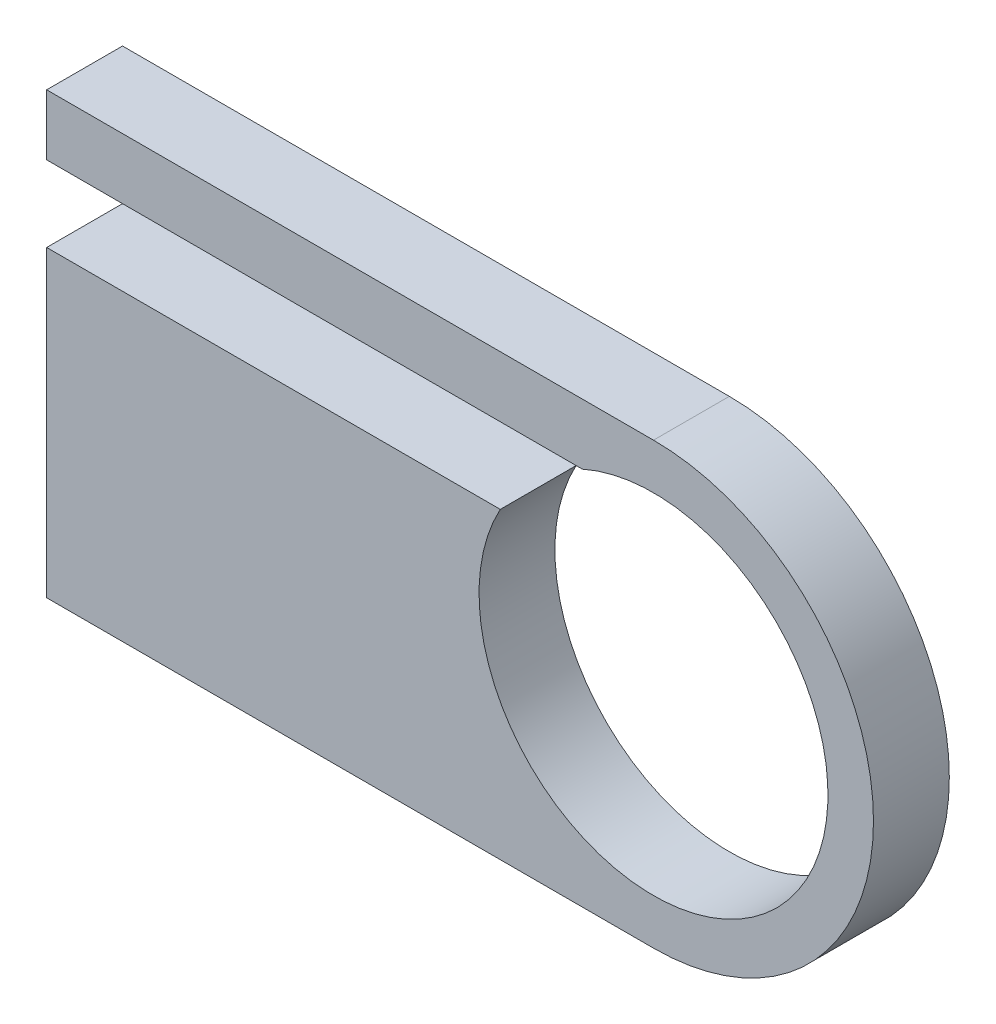
ISO-10303-21;
HEADER;
FILE_DESCRIPTION(('STEP AP214'),'2;1');
FILE_NAME('part.step','',(''),(''),'','','');
FILE_SCHEMA(('AUTOMOTIVE_DESIGN { 1 0 10303 214 1 1 1 1 }'));
ENDSEC;
DATA;
#1=APPLICATION_CONTEXT('core data for automotive mechanical design processes');
#2=APPLICATION_PROTOCOL_DEFINITION('international standard','automotive_design',2000,#1);
#3=PRODUCT_CONTEXT('',#1,'mechanical');
#4=PRODUCT('Part','Part','',(#3));
#5=PRODUCT_RELATED_PRODUCT_CATEGORY('part','',(#4));
#6=PRODUCT_DEFINITION_FORMATION('','',#4);
#7=PRODUCT_DEFINITION_CONTEXT('part definition',#1,'design');
#8=PRODUCT_DEFINITION('design','',#6,#7);
#9=PRODUCT_DEFINITION_SHAPE('','',#8);
#10=(LENGTH_UNIT() NAMED_UNIT(*) SI_UNIT(.MILLI.,.METRE.));
#11=(NAMED_UNIT(*) PLANE_ANGLE_UNIT() SI_UNIT($,.RADIAN.));
#12=(NAMED_UNIT(*) SI_UNIT($,.STERADIAN.) SOLID_ANGLE_UNIT());
#13=UNCERTAINTY_MEASURE_WITH_UNIT(LENGTH_MEASURE(1.E-05),#10,'distance_accuracy_value','');
#14=(GEOMETRIC_REPRESENTATION_CONTEXT(3) GLOBAL_UNCERTAINTY_ASSIGNED_CONTEXT((#13)) GLOBAL_UNIT_ASSIGNED_CONTEXT((#10,
#11,#12)) REPRESENTATION_CONTEXT('',''));
#15=CARTESIAN_POINT('',(0.,0.,0.));
#16=DIRECTION('',(0.,0.,1.));
#17=DIRECTION('',(1.,0.,0.));
#18=AXIS2_PLACEMENT_3D('',#15,#16,#17);
#19=CARTESIAN_POINT('',(0.,0.,5.));
#20=DIRECTION('',(0.,1.,0.));
#21=DIRECTION('',(0.,0.,1.));
#22=AXIS2_PLACEMENT_3D('',#19,#20,#21);
#23=PLANE('',#22);
#24=DIRECTION('',(1.,0.,0.));
#25=VECTOR('',#24,1.);
#26=CARTESIAN_POINT('',(0.,0.,0.));
#27=LINE('',#26,#25);
#28=CARTESIAN_POINT('',(0.,0.,0.));
#29=VERTEX_POINT('',#28);
#30=CARTESIAN_POINT('',(35.3095842401766,0.,0.));
#31=VERTEX_POINT('',#30);
#32=EDGE_CURVE('E129',#29,#31,#27,.T.);
#33=ORIENTED_EDGE('',*,*,#32,.T.);
#34=DIRECTION('',(0.,0.,-1.));
#35=VECTOR('',#34,1.);
#36=CARTESIAN_POINT('',(35.3095842401766,0.,5.));
#37=LINE('',#36,#35);
#38=CARTESIAN_POINT('',(35.3095842401766,0.,5.));
#39=VERTEX_POINT('',#38);
#40=EDGE_CURVE('E11',#39,#31,#37,.T.);
#41=ORIENTED_EDGE('',*,*,#40,.F.);
#42=DIRECTION('',(1.,0.,0.));
#43=VECTOR('',#42,1.);
#44=CARTESIAN_POINT('',(0.,0.,5.));
#45=LINE('',#44,#43);
#46=CARTESIAN_POINT('',(0.,0.,5.));
#47=VERTEX_POINT('',#46);
#48=EDGE_CURVE('E143',#47,#39,#45,.T.);
#49=ORIENTED_EDGE('',*,*,#48,.F.);
#50=DIRECTION('',(0.,0.,-1.));
#51=VECTOR('',#50,1.);
#52=CARTESIAN_POINT('',(0.,0.,5.));
#53=LINE('',#52,#51);
#54=EDGE_CURVE('E125',#47,#29,#53,.T.);
#55=ORIENTED_EDGE('',*,*,#54,.T.);
#56=EDGE_LOOP('',(#33,#41,#49,#55));
#57=FACE_BOUND('',#56,.T.);
#58=ADVANCED_FACE('F33',(#57),#23,.F.);
#59=CARTESIAN_POINT('',(40.,-10.5,5.));
#60=DIRECTION('',(0.,0.,-1.));
#61=DIRECTION('',(-1.,0.,0.));
#62=AXIS2_PLACEMENT_3D('',#59,#60,#61);
#63=CYLINDRICAL_SURFACE('',#62,11.5);
#64=CARTESIAN_POINT('',(40.,-10.5,0.));
#65=DIRECTION('',(0.,0.,-1.));
#66=DIRECTION('',(-1.,0.,0.));
#67=AXIS2_PLACEMENT_3D('',#64,#65,#66);
#68=CIRCLE('',#67,11.5);
#69=CARTESIAN_POINT('',(29.9004950616379,-5.,0.));
#70=VERTEX_POINT('',#69);
#71=EDGE_CURVE('E132',#31,#70,#68,.T.);
#72=ORIENTED_EDGE('',*,*,#71,.T.);
#73=DIRECTION('',(0.,0.,-1.));
#74=VECTOR('',#73,1.);
#75=CARTESIAN_POINT('',(29.9004950616379,-5.,5.));
#76=LINE('',#75,#74);
#77=CARTESIAN_POINT('',(29.9004950616379,-5.,5.));
#78=VERTEX_POINT('',#77);
#79=EDGE_CURVE('E41',#78,#70,#76,.T.);
#80=ORIENTED_EDGE('',*,*,#79,.F.);
#81=CARTESIAN_POINT('',(40.,-10.5,5.));
#82=DIRECTION('',(0.,0.,-1.));
#83=DIRECTION('',(-1.,0.,0.));
#84=AXIS2_PLACEMENT_3D('',#81,#82,#83);
#85=CIRCLE('',#84,11.5);
#86=EDGE_CURVE('E92',#39,#78,#85,.T.);
#87=ORIENTED_EDGE('',*,*,#86,.F.);
#88=ORIENTED_EDGE('',*,*,#40,.T.);
#89=EDGE_LOOP('',(#72,#80,#87,#88));
#90=FACE_BOUND('',#89,.T.);
#91=ADVANCED_FACE('F178',(#90),#63,.F.);
#92=CARTESIAN_POINT('',(29.9004950616379,-5.,5.));
#93=DIRECTION('',(0.,-1.,0.));
#94=DIRECTION('',(1.,0.,0.));
#95=AXIS2_PLACEMENT_3D('',#92,#93,#94);
#96=PLANE('',#95);
#97=DIRECTION('',(-1.,0.,0.));
#98=VECTOR('',#97,1.);
#99=CARTESIAN_POINT('',(29.9004950616379,-5.,0.));
#100=LINE('',#99,#98);
#101=CARTESIAN_POINT('',(0.,-5.,0.));
#102=VERTEX_POINT('',#101);
#103=EDGE_CURVE('E134',#70,#102,#100,.T.);
#104=ORIENTED_EDGE('',*,*,#103,.T.);
#105=DIRECTION('',(0.,0.,-1.));
#106=VECTOR('',#105,1.);
#107=CARTESIAN_POINT('',(0.,-5.,5.));
#108=LINE('',#107,#106);
#109=CARTESIAN_POINT('',(0.,-5.,5.));
#110=VERTEX_POINT('',#109);
#111=EDGE_CURVE('E150',#110,#102,#108,.T.);
#112=ORIENTED_EDGE('',*,*,#111,.F.);
#113=DIRECTION('',(-1.,0.,0.));
#114=VECTOR('',#113,1.);
#115=CARTESIAN_POINT('',(29.9004950616379,-5.,5.));
#116=LINE('',#115,#114);
#117=EDGE_CURVE('E158',#78,#110,#116,.T.);
#118=ORIENTED_EDGE('',*,*,#117,.F.);
#119=ORIENTED_EDGE('',*,*,#79,.T.);
#120=EDGE_LOOP('',(#104,#112,#118,#119));
#121=FACE_BOUND('',#120,.T.);
#122=ADVANCED_FACE('F156',(#121),#96,.F.);
#123=CARTESIAN_POINT('',(0.,-5.,5.));
#124=DIRECTION('',(1.,0.,0.));
#125=DIRECTION('',(0.,1.,0.));
#126=AXIS2_PLACEMENT_3D('',#123,#124,#125);
#127=PLANE('',#126);
#128=DIRECTION('',(0.,-1.,0.));
#129=VECTOR('',#128,1.);
#130=CARTESIAN_POINT('',(0.,-5.,0.));
#131=LINE('',#130,#129);
#132=CARTESIAN_POINT('',(0.,-25.,0.));
#133=VERTEX_POINT('',#132);
#134=EDGE_CURVE('E136',#102,#133,#131,.T.);
#135=ORIENTED_EDGE('',*,*,#134,.T.);
#136=DIRECTION('',(0.,0.,-1.));
#137=VECTOR('',#136,1.);
#138=CARTESIAN_POINT('',(0.,-25.,5.));
#139=LINE('',#138,#137);
#140=CARTESIAN_POINT('',(0.,-25.,5.));
#141=VERTEX_POINT('',#140);
#142=EDGE_CURVE('E147',#141,#133,#139,.T.);
#143=ORIENTED_EDGE('',*,*,#142,.F.);
#144=DIRECTION('',(0.,-1.,0.));
#145=VECTOR('',#144,1.);
#146=CARTESIAN_POINT('',(0.,-5.,5.));
#147=LINE('',#146,#145);
#148=EDGE_CURVE('E170',#110,#141,#147,.T.);
#149=ORIENTED_EDGE('',*,*,#148,.F.);
#150=ORIENTED_EDGE('',*,*,#111,.T.);
#151=EDGE_LOOP('',(#135,#143,#149,#150));
#152=FACE_BOUND('',#151,.T.);
#153=ADVANCED_FACE('F166',(#152),#127,.F.);
#154=CARTESIAN_POINT('',(0.,-25.,5.));
#155=DIRECTION('',(0.,1.,0.));
#156=DIRECTION('',(0.,0.,1.));
#157=AXIS2_PLACEMENT_3D('',#154,#155,#156);
#158=PLANE('',#157);
#159=DIRECTION('',(1.,0.,0.));
#160=VECTOR('',#159,1.);
#161=CARTESIAN_POINT('',(0.,-25.,0.));
#162=LINE('',#161,#160);
#163=CARTESIAN_POINT('',(40.,-25.,0.));
#164=VERTEX_POINT('',#163);
#165=EDGE_CURVE('E138',#133,#164,#162,.T.);
#166=ORIENTED_EDGE('',*,*,#165,.T.);
#167=DIRECTION('',(0.,0.,-1.));
#168=VECTOR('',#167,1.);
#169=CARTESIAN_POINT('',(40.,-25.,5.));
#170=LINE('',#169,#168);
#171=CARTESIAN_POINT('',(40.,-25.,5.));
#172=VERTEX_POINT('',#171);
#173=EDGE_CURVE('E120',#172,#164,#170,.T.);
#174=ORIENTED_EDGE('',*,*,#173,.F.);
#175=DIRECTION('',(1.,0.,0.));
#176=VECTOR('',#175,1.);
#177=CARTESIAN_POINT('',(0.,-25.,5.));
#178=LINE('',#177,#176);
#179=EDGE_CURVE('E111',#141,#172,#178,.T.);
#180=ORIENTED_EDGE('',*,*,#179,.F.);
#181=ORIENTED_EDGE('',*,*,#142,.T.);
#182=EDGE_LOOP('',(#166,#174,#180,#181));
#183=FACE_BOUND('',#182,.T.);
#184=ADVANCED_FACE('F169',(#183),#158,.F.);
#185=CARTESIAN_POINT('',(40.,-10.5,5.));
#186=DIRECTION('',(0.,0.,-1.));
#187=DIRECTION('',(-1.,0.,0.));
#188=AXIS2_PLACEMENT_3D('',#185,#186,#187);
#189=CYLINDRICAL_SURFACE('',#188,14.5);
#190=CARTESIAN_POINT('',(40.,-10.5,0.));
#191=DIRECTION('',(0.,0.,1.));
#192=DIRECTION('',(-1.,0.,0.));
#193=AXIS2_PLACEMENT_3D('',#190,#191,#192);
#194=CIRCLE('',#193,14.5);
#195=CARTESIAN_POINT('',(40.,4.,0.));
#196=VERTEX_POINT('',#195);
#197=EDGE_CURVE('E119',#164,#196,#194,.T.);
#198=ORIENTED_EDGE('',*,*,#197,.T.);
#199=DIRECTION('',(0.,0.,-1.));
#200=VECTOR('',#199,1.);
#201=CARTESIAN_POINT('',(40.,4.,5.));
#202=LINE('',#201,#200);
#203=CARTESIAN_POINT('',(40.,4.,5.));
#204=VERTEX_POINT('',#203);
#205=EDGE_CURVE('E116',#204,#196,#202,.T.);
#206=ORIENTED_EDGE('',*,*,#205,.F.);
#207=CARTESIAN_POINT('',(40.,-10.5,5.));
#208=DIRECTION('',(0.,0.,1.));
#209=DIRECTION('',(-1.,0.,0.));
#210=AXIS2_PLACEMENT_3D('',#207,#208,#209);
#211=CIRCLE('',#210,14.5);
#212=EDGE_CURVE('E105',#172,#204,#211,.T.);
#213=ORIENTED_EDGE('',*,*,#212,.F.);
#214=ORIENTED_EDGE('',*,*,#173,.T.);
#215=EDGE_LOOP('',(#198,#206,#213,#214));
#216=FACE_BOUND('',#215,.T.);
#217=ADVANCED_FACE('F117',(#216),#189,.T.);
#218=CARTESIAN_POINT('',(0.,4.,5.));
#219=DIRECTION('',(0.,-1.,0.));
#220=DIRECTION('',(0.,0.,-1.));
#221=AXIS2_PLACEMENT_3D('',#218,#219,#220);
#222=PLANE('',#221);
#223=DIRECTION('',(-1.,0.,0.));
#224=VECTOR('',#223,1.);
#225=CARTESIAN_POINT('',(0.,4.,0.));
#226=LINE('',#225,#224);
#227=CARTESIAN_POINT('',(0.,4.,0.));
#228=VERTEX_POINT('',#227);
#229=EDGE_CURVE('E78',#196,#228,#226,.T.);
#230=ORIENTED_EDGE('',*,*,#229,.T.);
#231=DIRECTION('',(0.,0.,-1.));
#232=VECTOR('',#231,1.);
#233=CARTESIAN_POINT('',(0.,4.,5.));
#234=LINE('',#233,#232);
#235=CARTESIAN_POINT('',(0.,4.,5.));
#236=VERTEX_POINT('',#235);
#237=EDGE_CURVE('E121',#236,#228,#234,.T.);
#238=ORIENTED_EDGE('',*,*,#237,.F.);
#239=DIRECTION('',(-1.,0.,0.));
#240=VECTOR('',#239,1.);
#241=CARTESIAN_POINT('',(0.,4.,5.));
#242=LINE('',#241,#240);
#243=EDGE_CURVE('E109',#204,#236,#242,.T.);
#244=ORIENTED_EDGE('',*,*,#243,.F.);
#245=ORIENTED_EDGE('',*,*,#205,.T.);
#246=EDGE_LOOP('',(#230,#238,#244,#245));
#247=FACE_BOUND('',#246,.T.);
#248=ADVANCED_FACE('F123',(#247),#222,.F.);
#249=CARTESIAN_POINT('',(0.,0.,5.));
#250=DIRECTION('',(1.,0.,0.));
#251=DIRECTION('',(0.,0.,-1.));
#252=AXIS2_PLACEMENT_3D('',#249,#250,#251);
#253=PLANE('',#252);
#254=DIRECTION('',(0.,-1.,0.));
#255=VECTOR('',#254,1.);
#256=CARTESIAN_POINT('',(0.,0.,0.));
#257=LINE('',#256,#255);
#258=EDGE_CURVE('E84',#228,#29,#257,.T.);
#259=ORIENTED_EDGE('',*,*,#258,.T.);
#260=ORIENTED_EDGE('',*,*,#54,.F.);
#261=DIRECTION('',(0.,-1.,0.));
#262=VECTOR('',#261,1.);
#263=CARTESIAN_POINT('',(0.,0.,5.));
#264=LINE('',#263,#262);
#265=EDGE_CURVE('E49',#236,#47,#264,.T.);
#266=ORIENTED_EDGE('',*,*,#265,.F.);
#267=ORIENTED_EDGE('',*,*,#237,.T.);
#268=EDGE_LOOP('',(#259,#260,#266,#267));
#269=FACE_BOUND('',#268,.T.);
#270=ADVANCED_FACE('F194',(#269),#253,.F.);
#271=CARTESIAN_POINT('',(40.,-10.5,5.));
#272=DIRECTION('',(0.,0.,-1.));
#273=DIRECTION('',(-1.,0.,0.));
#274=AXIS2_PLACEMENT_3D('',#271,#272,#273);
#275=PLANE('',#274);
#276=ORIENTED_EDGE('',*,*,#48,.T.);
#277=ORIENTED_EDGE('',*,*,#86,.T.);
#278=ORIENTED_EDGE('',*,*,#117,.T.);
#279=ORIENTED_EDGE('',*,*,#148,.T.);
#280=ORIENTED_EDGE('',*,*,#179,.T.);
#281=ORIENTED_EDGE('',*,*,#212,.T.);
#282=ORIENTED_EDGE('',*,*,#243,.T.);
#283=ORIENTED_EDGE('',*,*,#265,.T.);
#284=EDGE_LOOP('',(#276,#277,#278,#279,#280,#281,#282,#283));
#285=FACE_BOUND('',#284,.T.);
#286=ADVANCED_FACE('F107',(#285),#275,.F.);
#287=CARTESIAN_POINT('',(40.,-10.5,0.));
#288=DIRECTION('',(0.,0.,-1.));
#289=DIRECTION('',(-1.,0.,0.));
#290=AXIS2_PLACEMENT_3D('',#287,#288,#289);
#291=PLANE('',#290);
#292=ORIENTED_EDGE('',*,*,#32,.F.);
#293=ORIENTED_EDGE('',*,*,#258,.F.);
#294=ORIENTED_EDGE('',*,*,#229,.F.);
#295=ORIENTED_EDGE('',*,*,#197,.F.);
#296=ORIENTED_EDGE('',*,*,#165,.F.);
#297=ORIENTED_EDGE('',*,*,#134,.F.);
#298=ORIENTED_EDGE('',*,*,#103,.F.);
#299=ORIENTED_EDGE('',*,*,#71,.F.);
#300=EDGE_LOOP('',(#292,#293,#294,#295,#296,#297,#298,#299));
#301=FACE_BOUND('',#300,.T.);
#302=ADVANCED_FACE('F162',(#301),#291,.T.);
#303=CLOSED_SHELL('',(#58,#91,#122,#153,#184,#217,#248,#270,#286,#302));
#304=MANIFOLD_SOLID_BREP('B2',#303);
#305=ADVANCED_BREP_SHAPE_REPRESENTATION('',(#18,#304),#14);
#306=SHAPE_DEFINITION_REPRESENTATION(#9,#305);
ENDSEC;
END-ISO-10303-21;
